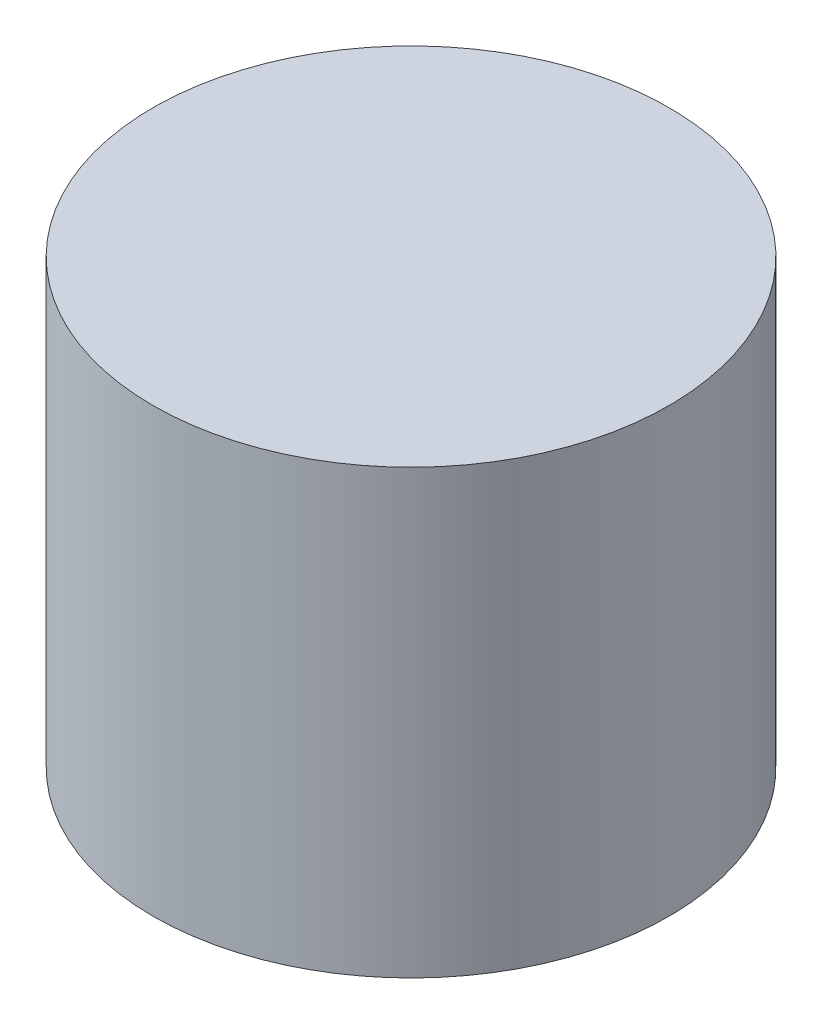
ISO-10303-21;
HEADER;
FILE_DESCRIPTION(('STEP AP214'),'2;1');
FILE_NAME('part.step','',(''),(''),'','','');
FILE_SCHEMA(('AUTOMOTIVE_DESIGN { 1 0 10303 214 1 1 1 1 }'));
ENDSEC;
DATA;
#1=APPLICATION_CONTEXT('core data for automotive mechanical design processes');
#2=APPLICATION_PROTOCOL_DEFINITION('international standard','automotive_design',2000,#1);
#3=PRODUCT_CONTEXT('',#1,'mechanical');
#4=PRODUCT('Part','Part','',(#3));
#5=PRODUCT_RELATED_PRODUCT_CATEGORY('part','',(#4));
#6=PRODUCT_DEFINITION_FORMATION('','',#4);
#7=PRODUCT_DEFINITION_CONTEXT('part definition',#1,'design');
#8=PRODUCT_DEFINITION('design','',#6,#7);
#9=PRODUCT_DEFINITION_SHAPE('','',#8);
#10=(LENGTH_UNIT() NAMED_UNIT(*) SI_UNIT(.MILLI.,.METRE.));
#11=(NAMED_UNIT(*) PLANE_ANGLE_UNIT() SI_UNIT($,.RADIAN.));
#12=(NAMED_UNIT(*) SI_UNIT($,.STERADIAN.) SOLID_ANGLE_UNIT());
#13=UNCERTAINTY_MEASURE_WITH_UNIT(LENGTH_MEASURE(1.E-05),#10,'distance_accuracy_value','');
#14=(GEOMETRIC_REPRESENTATION_CONTEXT(3) GLOBAL_UNCERTAINTY_ASSIGNED_CONTEXT((#13)) GLOBAL_UNIT_ASSIGNED_CONTEXT((#10,
#11,#12)) REPRESENTATION_CONTEXT('',''));
#15=CARTESIAN_POINT('',(0.,0.,0.));
#16=DIRECTION('',(0.,0.,1.));
#17=DIRECTION('',(1.,0.,0.));
#18=AXIS2_PLACEMENT_3D('',#15,#16,#17);
#19=CARTESIAN_POINT('',(0.,6.,0.));
#20=DIRECTION('',(0.,-1.,0.));
#21=DIRECTION('',(0.,0.,-1.));
#22=AXIS2_PLACEMENT_3D('',#19,#20,#21);
#23=CYLINDRICAL_SURFACE('',#22,3.5);
#24=CARTESIAN_POINT('',(0.,6.,0.));
#25=DIRECTION('',(0.,1.,0.));
#26=DIRECTION('',(0.,0.,1.));
#27=AXIS2_PLACEMENT_3D('',#24,#25,#26);
#28=CIRCLE('',#27,3.5);
#29=CARTESIAN_POINT('',(0.,6.,3.5));
#30=VERTEX_POINT('',#29);
#31=EDGE_CURVE('E10',#30,#30,#28,.T.);
#32=ORIENTED_EDGE('',*,*,#31,.F.);
#33=EDGE_LOOP('',(#32));
#34=FACE_BOUND('',#33,.T.);
#35=CARTESIAN_POINT('',(0.,0.,0.));
#36=DIRECTION('',(0.,1.,0.));
#37=DIRECTION('',(0.,0.,1.));
#38=AXIS2_PLACEMENT_3D('',#35,#36,#37);
#39=CIRCLE('',#38,3.5);
#40=CARTESIAN_POINT('',(0.,0.,3.5));
#41=VERTEX_POINT('',#40);
#42=EDGE_CURVE('E46',#41,#41,#39,.T.);
#43=ORIENTED_EDGE('',*,*,#42,.T.);
#44=EDGE_LOOP('',(#43));
#45=FACE_BOUND('',#44,.T.);
#46=ADVANCED_FACE('F43',(#34,#45),#23,.T.);
#47=CARTESIAN_POINT('',(0.,6.,0.));
#48=DIRECTION('',(0.,1.,0.));
#49=DIRECTION('',(0.,0.,1.));
#50=AXIS2_PLACEMENT_3D('',#47,#48,#49);
#51=PLANE('',#50);
#52=ORIENTED_EDGE('',*,*,#31,.T.);
#53=EDGE_LOOP('',(#52));
#54=FACE_BOUND('',#53,.T.);
#55=ADVANCED_FACE('F60',(#54),#51,.T.);
#56=CARTESIAN_POINT('',(0.,0.,0.));
#57=DIRECTION('',(0.,1.,0.));
#58=DIRECTION('',(0.,0.,1.));
#59=AXIS2_PLACEMENT_3D('',#56,#57,#58);
#60=PLANE('',#59);
#61=ORIENTED_EDGE('',*,*,#42,.F.);
#62=EDGE_LOOP('',(#61));
#63=FACE_BOUND('',#62,.T.);
#64=ADVANCED_FACE('F58',(#63),#60,.F.);
#65=CLOSED_SHELL('',(#46,#55,#64));
#66=MANIFOLD_SOLID_BREP('B2',#65);
#67=ADVANCED_BREP_SHAPE_REPRESENTATION('',(#18,#66),#14);
#68=SHAPE_DEFINITION_REPRESENTATION(#9,#67);
ENDSEC;
END-ISO-10303-21;
